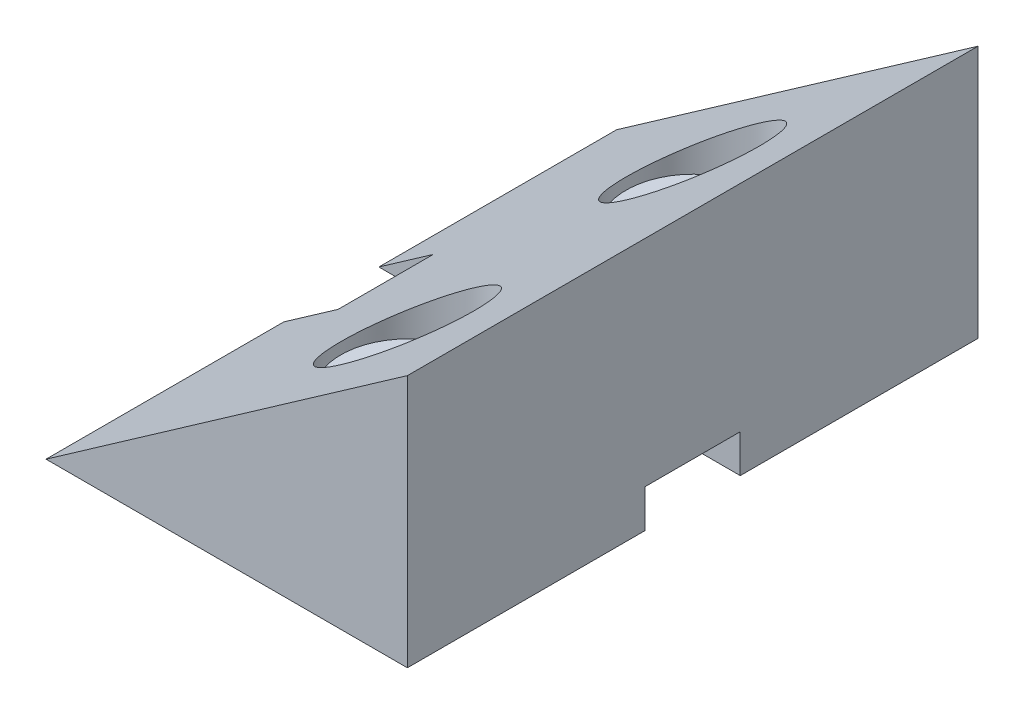
ISO-10303-21;
HEADER;
FILE_DESCRIPTION(('STEP AP214'),'2;1');
FILE_NAME('part.step','',(''),(''),'','','');
FILE_SCHEMA(('AUTOMOTIVE_DESIGN { 1 0 10303 214 1 1 1 1 }'));
ENDSEC;
DATA;
#1=APPLICATION_CONTEXT('core data for automotive mechanical design processes');
#2=APPLICATION_PROTOCOL_DEFINITION('international standard','automotive_design',2000,#1);
#3=PRODUCT_CONTEXT('',#1,'mechanical');
#4=PRODUCT('Part','Part','',(#3));
#5=PRODUCT_RELATED_PRODUCT_CATEGORY('part','',(#4));
#6=PRODUCT_DEFINITION_FORMATION('','',#4);
#7=PRODUCT_DEFINITION_CONTEXT('part definition',#1,'design');
#8=PRODUCT_DEFINITION('design','',#6,#7);
#9=PRODUCT_DEFINITION_SHAPE('','',#8);
#10=(LENGTH_UNIT() NAMED_UNIT(*) SI_UNIT(.MILLI.,.METRE.));
#11=(NAMED_UNIT(*) PLANE_ANGLE_UNIT() SI_UNIT($,.RADIAN.));
#12=(NAMED_UNIT(*) SI_UNIT($,.STERADIAN.) SOLID_ANGLE_UNIT());
#13=UNCERTAINTY_MEASURE_WITH_UNIT(LENGTH_MEASURE(1.E-05),#10,'distance_accuracy_value','');
#14=(GEOMETRIC_REPRESENTATION_CONTEXT(3) GLOBAL_UNCERTAINTY_ASSIGNED_CONTEXT((#13)) GLOBAL_UNIT_ASSIGNED_CONTEXT((#10,
#11,#12)) REPRESENTATION_CONTEXT('',''));
#15=CARTESIAN_POINT('',(0.,0.,0.));
#16=DIRECTION('',(0.,0.,1.));
#17=DIRECTION('',(1.,0.,0.));
#18=AXIS2_PLACEMENT_3D('',#15,#16,#17);
#19=CARTESIAN_POINT('',(0.,0.,30.));
#20=DIRECTION('',(0.,1.,0.));
#21=DIRECTION('',(-1.,0.,0.));
#22=AXIS2_PLACEMENT_3D('',#19,#20,#21);
#23=PLANE('',#22);
#24=CARTESIAN_POINT('',(-7.5,0.,22.5));
#25=DIRECTION('',(0.,1.,0.));
#26=DIRECTION('',(-1.,0.,0.));
#27=AXIS2_PLACEMENT_3D('',#24,#25,#26);
#28=CIRCLE('',#27,1.75);
#29=CARTESIAN_POINT('',(-9.25,0.,22.5));
#30=VERTEX_POINT('',#29);
#31=EDGE_CURVE('E146',#30,#30,#28,.F.);
#32=ORIENTED_EDGE('',*,*,#31,.F.);
#33=EDGE_LOOP('',(#32));
#34=FACE_BOUND('',#33,.T.);
#35=DIRECTION('',(0.,0.,-1.));
#36=VECTOR('',#35,1.);
#37=CARTESIAN_POINT('',(-19.,0.,30.));
#38=LINE('',#37,#36);
#39=CARTESIAN_POINT('',(-19.,0.,30.));
#40=VERTEX_POINT('',#39);
#41=CARTESIAN_POINT('',(-19.,0.,17.5));
#42=VERTEX_POINT('',#41);
#43=EDGE_CURVE('E45',#40,#42,#38,.T.);
#44=ORIENTED_EDGE('',*,*,#43,.T.);
#45=DIRECTION('',(1.,0.,0.));
#46=VECTOR('',#45,1.);
#47=CARTESIAN_POINT('',(-19.001,0.,17.5));
#48=LINE('',#47,#46);
#49=CARTESIAN_POINT('',(0.,0.,17.5));
#50=VERTEX_POINT('',#49);
#51=EDGE_CURVE('E106',#42,#50,#48,.T.);
#52=ORIENTED_EDGE('',*,*,#51,.T.);
#53=DIRECTION('',(0.,0.,-1.));
#54=VECTOR('',#53,1.);
#55=CARTESIAN_POINT('',(0.,0.,30.));
#56=LINE('',#55,#54);
#57=CARTESIAN_POINT('',(0.,0.,30.));
#58=VERTEX_POINT('',#57);
#59=EDGE_CURVE('E124',#58,#50,#56,.T.);
#60=ORIENTED_EDGE('',*,*,#59,.F.);
#61=DIRECTION('',(1.,0.,0.));
#62=VECTOR('',#61,1.);
#63=CARTESIAN_POINT('',(0.,0.,30.));
#64=LINE('',#63,#62);
#65=EDGE_CURVE('E61',#40,#58,#64,.T.);
#66=ORIENTED_EDGE('',*,*,#65,.F.);
#67=EDGE_LOOP('',(#44,#52,#60,#66));
#68=FACE_BOUND('',#67,.T.);
#69=ADVANCED_FACE('F37',(#34,#68),#23,.F.);
#70=CARTESIAN_POINT('',(0.,13.3039432259843,30.));
#71=DIRECTION('',(-1.,0.,0.));
#72=DIRECTION('',(0.,-1.,0.));
#73=AXIS2_PLACEMENT_3D('',#70,#71,#72);
#74=PLANE('',#73);
#75=ORIENTED_EDGE('',*,*,#59,.T.);
#76=DIRECTION('',(0.,-1.,0.));
#77=VECTOR('',#76,1.);
#78=CARTESIAN_POINT('',(0.,2.,17.5));
#79=LINE('',#78,#77);
#80=CARTESIAN_POINT('',(0.,2.,17.5));
#81=VERTEX_POINT('',#80);
#82=EDGE_CURVE('E112',#81,#50,#79,.T.);
#83=ORIENTED_EDGE('',*,*,#82,.F.);
#84=DIRECTION('',(0.,0.,1.));
#85=VECTOR('',#84,1.);
#86=CARTESIAN_POINT('',(0.,2.,17.5));
#87=LINE('',#86,#85);
#88=CARTESIAN_POINT('',(0.,2.,12.5));
#89=VERTEX_POINT('',#88);
#90=EDGE_CURVE('E117',#89,#81,#87,.T.);
#91=ORIENTED_EDGE('',*,*,#90,.F.);
#92=DIRECTION('',(0.,1.,0.));
#93=VECTOR('',#92,1.);
#94=CARTESIAN_POINT('',(0.,2.,12.5));
#95=LINE('',#94,#93);
#96=CARTESIAN_POINT('',(0.,0.,12.5));
#97=VERTEX_POINT('',#96);
#98=EDGE_CURVE('E169',#97,#89,#95,.T.);
#99=ORIENTED_EDGE('',*,*,#98,.F.);
#100=CARTESIAN_POINT('',(0.,0.,0.));
#101=VERTEX_POINT('',#100);
#102=EDGE_CURVE('E79',#97,#101,#56,.T.);
#103=ORIENTED_EDGE('',*,*,#102,.T.);
#104=DIRECTION('',(0.,1.,0.));
#105=VECTOR('',#104,1.);
#106=CARTESIAN_POINT('',(0.,13.3039432259843,0.));
#107=LINE('',#106,#105);
#108=CARTESIAN_POINT('',(0.,13.3039432259843,0.));
#109=VERTEX_POINT('',#108);
#110=EDGE_CURVE('E133',#101,#109,#107,.T.);
#111=ORIENTED_EDGE('',*,*,#110,.T.);
#112=DIRECTION('',(0.,0.,-1.));
#113=VECTOR('',#112,1.);
#114=CARTESIAN_POINT('',(0.,13.3039432259843,30.));
#115=LINE('',#114,#113);
#116=CARTESIAN_POINT('',(0.,13.3039432259843,30.));
#117=VERTEX_POINT('',#116);
#118=EDGE_CURVE('E11',#117,#109,#115,.T.);
#119=ORIENTED_EDGE('',*,*,#118,.F.);
#120=DIRECTION('',(0.,1.,0.));
#121=VECTOR('',#120,1.);
#122=CARTESIAN_POINT('',(0.,13.3039432259843,30.));
#123=LINE('',#122,#121);
#124=EDGE_CURVE('E129',#58,#117,#123,.T.);
#125=ORIENTED_EDGE('',*,*,#124,.F.);
#126=EDGE_LOOP('',(#75,#83,#91,#99,#103,#111,#119,#125));
#127=FACE_BOUND('',#126,.T.);
#128=ADVANCED_FACE('F39',(#127),#74,.F.);
#129=CARTESIAN_POINT('',(-19.,0.,30.));
#130=DIRECTION('',(0.573576436351042,-0.819152044288995,0.));
#131=DIRECTION('',(0.819152044288995,0.573576436351042,0.));
#132=AXIS2_PLACEMENT_3D('',#129,#130,#131);
#133=PLANE('',#132);
#134=CARTESIAN_POINT('',(-7.5,8.05238668941157,7.5));
#135=DIRECTION('',(0.573576436351042,-0.819152044288995,0.));
#136=DIRECTION('',(-0.819152044288995,-0.573576436351042,0.));
#137=AXIS2_PLACEMENT_3D('',#134,#135,#136);
#138=ELLIPSE('',#137,4.27271106066508,3.5);
#139=CARTESIAN_POINT('',(-11.,5.60166030567761,7.5));
#140=VERTEX_POINT('',#139);
#141=EDGE_CURVE('E135',#140,#140,#138,.F.);
#142=ORIENTED_EDGE('',*,*,#141,.F.);
#143=EDGE_LOOP('',(#142));
#144=FACE_BOUND('',#143,.T.);
#145=CARTESIAN_POINT('',(-7.5,8.05238668941157,22.5));
#146=DIRECTION('',(0.573576436351042,-0.819152044288995,0.));
#147=DIRECTION('',(-0.819152044288995,-0.573576436351042,0.));
#148=AXIS2_PLACEMENT_3D('',#145,#146,#147);
#149=ELLIPSE('',#148,4.27271106066508,3.5);
#150=CARTESIAN_POINT('',(-11.,5.60166030567761,22.5));
#151=VERTEX_POINT('',#150);
#152=EDGE_CURVE('E139',#151,#151,#149,.F.);
#153=ORIENTED_EDGE('',*,*,#152,.F.);
#154=EDGE_LOOP('',(#153));
#155=FACE_BOUND('',#154,.T.);
#156=DIRECTION('',(0.,0.,-1.));
#157=VECTOR('',#156,1.);
#158=CARTESIAN_POINT('',(-16.1437039865157,2.,17.5));
#159=LINE('',#158,#157);
#160=CARTESIAN_POINT('',(-16.1437039865157,2.,17.5));
#161=VERTEX_POINT('',#160);
#162=CARTESIAN_POINT('',(-16.1437039865157,2.,12.5));
#163=VERTEX_POINT('',#162);
#164=EDGE_CURVE('E121',#161,#163,#159,.T.);
#165=ORIENTED_EDGE('',*,*,#164,.F.);
#166=DIRECTION('',(0.819152044288995,0.573576436351042,0.));
#167=VECTOR('',#166,1.);
#168=CARTESIAN_POINT('',(-18.0609783892858,0.657510010363926,17.5));
#169=LINE('',#168,#167);
#170=EDGE_CURVE('E109',#42,#161,#169,.T.);
#171=ORIENTED_EDGE('',*,*,#170,.F.);
#172=ORIENTED_EDGE('',*,*,#43,.F.);
#173=DIRECTION('',(-0.819152044288995,-0.573576436351042,0.));
#174=VECTOR('',#173,1.);
#175=CARTESIAN_POINT('',(-19.,0.,30.));
#176=LINE('',#175,#174);
#177=EDGE_CURVE('E84',#117,#40,#176,.T.);
#178=ORIENTED_EDGE('',*,*,#177,.F.);
#179=ORIENTED_EDGE('',*,*,#118,.T.);
#180=DIRECTION('',(-0.819152044288995,-0.573576436351042,0.));
#181=VECTOR('',#180,1.);
#182=CARTESIAN_POINT('',(-19.,0.,0.));
#183=LINE('',#182,#181);
#184=CARTESIAN_POINT('',(-19.,0.,0.));
#185=VERTEX_POINT('',#184);
#186=EDGE_CURVE('E130',#109,#185,#183,.T.);
#187=ORIENTED_EDGE('',*,*,#186,.T.);
#188=CARTESIAN_POINT('',(-19.,0.,12.5));
#189=VERTEX_POINT('',#188);
#190=EDGE_CURVE('E123',#189,#185,#38,.T.);
#191=ORIENTED_EDGE('',*,*,#190,.F.);
#192=DIRECTION('',(-0.819152044288995,-0.573576436351042,0.));
#193=VECTOR('',#192,1.);
#194=CARTESIAN_POINT('',(-18.0609783892858,0.657510010363926,12.5));
#195=LINE('',#194,#193);
#196=EDGE_CURVE('E52',#163,#189,#195,.T.);
#197=ORIENTED_EDGE('',*,*,#196,.F.);
#198=EDGE_LOOP('',(#165,#171,#172,#178,#179,#187,#191,#197));
#199=FACE_BOUND('',#198,.T.);
#200=ADVANCED_FACE('F119',(#144,#155,#199),#133,.F.);
#201=CARTESIAN_POINT('',(-7.5,0.,7.5));
#202=DIRECTION('',(0.,1.,0.));
#203=DIRECTION('',(-1.,0.,0.));
#204=AXIS2_PLACEMENT_3D('',#201,#202,#203);
#205=CIRCLE('',#204,1.75);
#206=CARTESIAN_POINT('',(-9.25,0.,7.5));
#207=VERTEX_POINT('',#206);
#208=EDGE_CURVE('E155',#207,#207,#205,.F.);
#209=ORIENTED_EDGE('',*,*,#208,.F.);
#210=EDGE_LOOP('',(#209));
#211=FACE_BOUND('',#210,.T.);
#212=ORIENTED_EDGE('',*,*,#102,.F.);
#213=DIRECTION('',(1.,0.,0.));
#214=VECTOR('',#213,1.);
#215=CARTESIAN_POINT('',(-19.001,0.,12.5));
#216=LINE('',#215,#214);
#217=EDGE_CURVE('E116',#189,#97,#216,.T.);
#218=ORIENTED_EDGE('',*,*,#217,.F.);
#219=ORIENTED_EDGE('',*,*,#190,.T.);
#220=DIRECTION('',(1.,0.,0.));
#221=VECTOR('',#220,1.);
#222=CARTESIAN_POINT('',(0.,0.,0.));
#223=LINE('',#222,#221);
#224=EDGE_CURVE('E127',#185,#101,#223,.T.);
#225=ORIENTED_EDGE('',*,*,#224,.T.);
#226=EDGE_LOOP('',(#212,#218,#219,#225));
#227=FACE_BOUND('',#226,.T.);
#228=ADVANCED_FACE('F179',(#211,#227),#23,.F.);
#229=CARTESIAN_POINT('',(0.,0.,30.));
#230=DIRECTION('',(0.,0.,-1.));
#231=DIRECTION('',(-1.,0.,0.));
#232=AXIS2_PLACEMENT_3D('',#229,#230,#231);
#233=PLANE('',#232);
#234=ORIENTED_EDGE('',*,*,#124,.T.);
#235=ORIENTED_EDGE('',*,*,#177,.T.);
#236=ORIENTED_EDGE('',*,*,#65,.T.);
#237=EDGE_LOOP('',(#234,#235,#236));
#238=FACE_BOUND('',#237,.T.);
#239=ADVANCED_FACE('F185',(#238),#233,.F.);
#240=CARTESIAN_POINT('',(0.,0.,0.));
#241=DIRECTION('',(0.,0.,-1.));
#242=DIRECTION('',(-1.,0.,0.));
#243=AXIS2_PLACEMENT_3D('',#240,#241,#242);
#244=PLANE('',#243);
#245=ORIENTED_EDGE('',*,*,#110,.F.);
#246=ORIENTED_EDGE('',*,*,#224,.F.);
#247=ORIENTED_EDGE('',*,*,#186,.F.);
#248=EDGE_LOOP('',(#245,#246,#247));
#249=FACE_BOUND('',#248,.T.);
#250=ADVANCED_FACE('F187',(#249),#244,.T.);
#251=CARTESIAN_POINT('',(-7.5,13.3049432259843,22.5));
#252=DIRECTION('',(0.,-1.,0.));
#253=DIRECTION('',(1.,0.,0.));
#254=AXIS2_PLACEMENT_3D('',#251,#252,#253);
#255=CYLINDRICAL_SURFACE('',#254,3.5);
#256=CARTESIAN_POINT('',(-7.5,5.,22.5));
#257=DIRECTION('',(0.,-1.,0.));
#258=DIRECTION('',(1.,0.,0.));
#259=AXIS2_PLACEMENT_3D('',#256,#257,#258);
#260=CIRCLE('',#259,3.5);
#261=CARTESIAN_POINT('',(-4.,5.,22.5));
#262=VERTEX_POINT('',#261);
#263=EDGE_CURVE('E143',#262,#262,#260,.T.);
#264=ORIENTED_EDGE('',*,*,#263,.T.);
#265=EDGE_LOOP('',(#264));
#266=FACE_BOUND('',#265,.T.);
#267=ORIENTED_EDGE('',*,*,#152,.T.);
#268=EDGE_LOOP('',(#267));
#269=FACE_BOUND('',#268,.T.);
#270=ADVANCED_FACE('F193',(#266,#269),#255,.F.);
#271=CARTESIAN_POINT('',(-7.5,5.,22.5));
#272=DIRECTION('',(0.,-1.,0.));
#273=DIRECTION('',(1.,0.,0.));
#274=AXIS2_PLACEMENT_3D('',#271,#272,#273);
#275=PLANE('',#274);
#276=CARTESIAN_POINT('',(-7.5,5.,22.5));
#277=DIRECTION('',(0.,1.,0.));
#278=DIRECTION('',(-1.,0.,0.));
#279=AXIS2_PLACEMENT_3D('',#276,#277,#278);
#280=CIRCLE('',#279,1.75);
#281=CARTESIAN_POINT('',(-9.25,5.,22.5));
#282=VERTEX_POINT('',#281);
#283=EDGE_CURVE('E154',#282,#282,#280,.T.);
#284=ORIENTED_EDGE('',*,*,#283,.F.);
#285=EDGE_LOOP('',(#284));
#286=FACE_BOUND('',#285,.T.);
#287=ORIENTED_EDGE('',*,*,#263,.F.);
#288=EDGE_LOOP('',(#287));
#289=FACE_BOUND('',#288,.T.);
#290=ADVANCED_FACE('F214',(#286,#289),#275,.F.);
#291=CARTESIAN_POINT('',(-7.5,13.3049432259843,7.5));
#292=DIRECTION('',(0.,-1.,0.));
#293=DIRECTION('',(1.,0.,0.));
#294=AXIS2_PLACEMENT_3D('',#291,#292,#293);
#295=CYLINDRICAL_SURFACE('',#294,3.5);
#296=CARTESIAN_POINT('',(-7.5,5.,7.5));
#297=DIRECTION('',(0.,-1.,0.));
#298=DIRECTION('',(1.,0.,0.));
#299=AXIS2_PLACEMENT_3D('',#296,#297,#298);
#300=CIRCLE('',#299,3.5);
#301=CARTESIAN_POINT('',(-4.,5.,7.5));
#302=VERTEX_POINT('',#301);
#303=EDGE_CURVE('E142',#302,#302,#300,.T.);
#304=ORIENTED_EDGE('',*,*,#303,.T.);
#305=EDGE_LOOP('',(#304));
#306=FACE_BOUND('',#305,.T.);
#307=ORIENTED_EDGE('',*,*,#141,.T.);
#308=EDGE_LOOP('',(#307));
#309=FACE_BOUND('',#308,.T.);
#310=ADVANCED_FACE('F219',(#306,#309),#295,.F.);
#311=CARTESIAN_POINT('',(-7.5,5.,7.5));
#312=DIRECTION('',(0.,-1.,0.));
#313=DIRECTION('',(1.,0.,0.));
#314=AXIS2_PLACEMENT_3D('',#311,#312,#313);
#315=PLANE('',#314);
#316=CARTESIAN_POINT('',(-7.5,5.,7.5));
#317=DIRECTION('',(0.,1.,0.));
#318=DIRECTION('',(-1.,0.,0.));
#319=AXIS2_PLACEMENT_3D('',#316,#317,#318);
#320=CIRCLE('',#319,1.75);
#321=CARTESIAN_POINT('',(-9.25,5.,7.5));
#322=VERTEX_POINT('',#321);
#323=EDGE_CURVE('E151',#322,#322,#320,.T.);
#324=ORIENTED_EDGE('',*,*,#323,.F.);
#325=EDGE_LOOP('',(#324));
#326=FACE_BOUND('',#325,.T.);
#327=ORIENTED_EDGE('',*,*,#303,.F.);
#328=EDGE_LOOP('',(#327));
#329=FACE_BOUND('',#328,.T.);
#330=ADVANCED_FACE('F225',(#326,#329),#315,.F.);
#331=CARTESIAN_POINT('',(-7.5,-0.0010000000000036,7.5));
#332=DIRECTION('',(0.,1.,0.));
#333=DIRECTION('',(-1.,0.,0.));
#334=AXIS2_PLACEMENT_3D('',#331,#332,#333);
#335=CYLINDRICAL_SURFACE('',#334,1.75);
#336=ORIENTED_EDGE('',*,*,#323,.T.);
#337=EDGE_LOOP('',(#336));
#338=FACE_BOUND('',#337,.T.);
#339=ORIENTED_EDGE('',*,*,#208,.T.);
#340=EDGE_LOOP('',(#339));
#341=FACE_BOUND('',#340,.T.);
#342=ADVANCED_FACE('F229',(#338,#341),#335,.F.);
#343=CARTESIAN_POINT('',(-7.5,-0.0010000000000036,22.5));
#344=DIRECTION('',(0.,1.,0.));
#345=DIRECTION('',(-1.,0.,0.));
#346=AXIS2_PLACEMENT_3D('',#343,#344,#345);
#347=CYLINDRICAL_SURFACE('',#346,1.75);
#348=ORIENTED_EDGE('',*,*,#283,.T.);
#349=EDGE_LOOP('',(#348));
#350=FACE_BOUND('',#349,.T.);
#351=ORIENTED_EDGE('',*,*,#31,.T.);
#352=EDGE_LOOP('',(#351));
#353=FACE_BOUND('',#352,.T.);
#354=ADVANCED_FACE('F233',(#350,#353),#347,.F.);
#355=CARTESIAN_POINT('',(-19.001,2.,17.5));
#356=DIRECTION('',(0.,0.,1.));
#357=DIRECTION('',(0.,-1.,0.));
#358=AXIS2_PLACEMENT_3D('',#355,#356,#357);
#359=PLANE('',#358);
#360=ORIENTED_EDGE('',*,*,#170,.T.);
#361=DIRECTION('',(1.,0.,0.));
#362=VECTOR('',#361,1.);
#363=CARTESIAN_POINT('',(-19.001,2.,17.5));
#364=LINE('',#363,#362);
#365=EDGE_CURVE('E158',#161,#81,#364,.T.);
#366=ORIENTED_EDGE('',*,*,#365,.T.);
#367=ORIENTED_EDGE('',*,*,#82,.T.);
#368=ORIENTED_EDGE('',*,*,#51,.F.);
#369=EDGE_LOOP('',(#360,#366,#367,#368));
#370=FACE_BOUND('',#369,.T.);
#371=ADVANCED_FACE('F108',(#370),#359,.F.);
#372=CARTESIAN_POINT('',(-19.001,2.,17.5));
#373=DIRECTION('',(0.,1.,0.));
#374=DIRECTION('',(-1.,0.,0.));
#375=AXIS2_PLACEMENT_3D('',#372,#373,#374);
#376=PLANE('',#375);
#377=ORIENTED_EDGE('',*,*,#164,.T.);
#378=DIRECTION('',(1.,0.,0.));
#379=VECTOR('',#378,1.);
#380=CARTESIAN_POINT('',(-19.001,2.,12.5));
#381=LINE('',#380,#379);
#382=EDGE_CURVE('E164',#163,#89,#381,.T.);
#383=ORIENTED_EDGE('',*,*,#382,.T.);
#384=ORIENTED_EDGE('',*,*,#90,.T.);
#385=ORIENTED_EDGE('',*,*,#365,.F.);
#386=EDGE_LOOP('',(#377,#383,#384,#385));
#387=FACE_BOUND('',#386,.T.);
#388=ADVANCED_FACE('F175',(#387),#376,.F.);
#389=CARTESIAN_POINT('',(-19.001,2.,12.5));
#390=DIRECTION('',(0.,0.,-1.));
#391=DIRECTION('',(0.,1.,0.));
#392=AXIS2_PLACEMENT_3D('',#389,#390,#391);
#393=PLANE('',#392);
#394=ORIENTED_EDGE('',*,*,#196,.T.);
#395=ORIENTED_EDGE('',*,*,#217,.T.);
#396=ORIENTED_EDGE('',*,*,#98,.T.);
#397=ORIENTED_EDGE('',*,*,#382,.F.);
#398=EDGE_LOOP('',(#394,#395,#396,#397));
#399=FACE_BOUND('',#398,.T.);
#400=ADVANCED_FACE('F181',(#399),#393,.F.);
#401=CLOSED_SHELL('',(#69,#128,#200,#228,#239,#250,#270,#290,#310,#330,#342,#354,#371,#388,#400));
#402=MANIFOLD_SOLID_BREP('B2',#401);
#403=ADVANCED_BREP_SHAPE_REPRESENTATION('',(#18,#402),#14);
#404=SHAPE_DEFINITION_REPRESENTATION(#9,#403);
ENDSEC;
END-ISO-10303-21;
